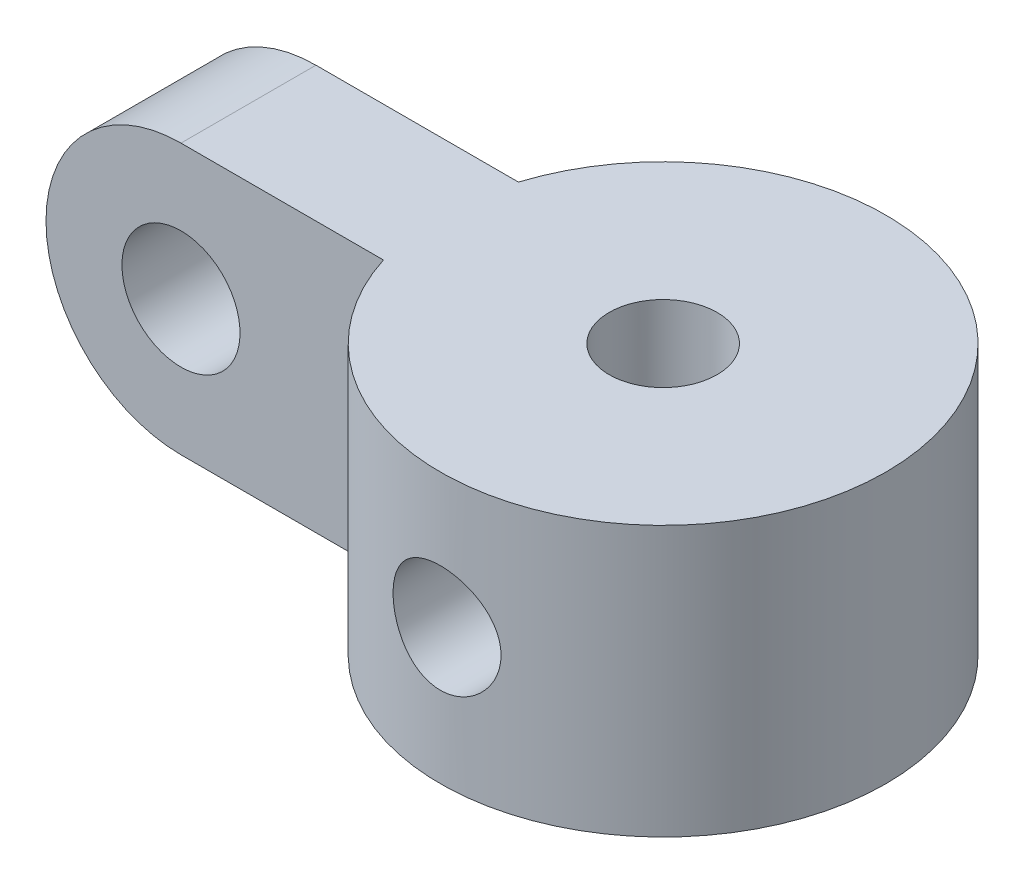
ISO-10303-21;
HEADER;
FILE_DESCRIPTION(('STEP AP214'),'2;1');
FILE_NAME('part.step','',(''),(''),'','','');
FILE_SCHEMA(('AUTOMOTIVE_DESIGN { 1 0 10303 214 1 1 1 1 }'));
ENDSEC;
DATA;
#1=APPLICATION_CONTEXT('core data for automotive mechanical design processes');
#2=APPLICATION_PROTOCOL_DEFINITION('international standard','automotive_design',2000,#1);
#3=PRODUCT_CONTEXT('',#1,'mechanical');
#4=PRODUCT('Part','Part','',(#3));
#5=PRODUCT_RELATED_PRODUCT_CATEGORY('part','',(#4));
#6=PRODUCT_DEFINITION_FORMATION('','',#4);
#7=PRODUCT_DEFINITION_CONTEXT('part definition',#1,'design');
#8=PRODUCT_DEFINITION('design','',#6,#7);
#9=PRODUCT_DEFINITION_SHAPE('','',#8);
#10=(LENGTH_UNIT() NAMED_UNIT(*) SI_UNIT(.MILLI.,.METRE.));
#11=(NAMED_UNIT(*) PLANE_ANGLE_UNIT() SI_UNIT($,.RADIAN.));
#12=(NAMED_UNIT(*) SI_UNIT($,.STERADIAN.) SOLID_ANGLE_UNIT());
#13=UNCERTAINTY_MEASURE_WITH_UNIT(LENGTH_MEASURE(1.E-05),#10,'distance_accuracy_value','');
#14=(GEOMETRIC_REPRESENTATION_CONTEXT(3) GLOBAL_UNCERTAINTY_ASSIGNED_CONTEXT((#13)) GLOBAL_UNIT_ASSIGNED_CONTEXT((#10,
#11,#12)) REPRESENTATION_CONTEXT('',''));
#15=CARTESIAN_POINT('',(0.,0.,0.));
#16=DIRECTION('',(0.,0.,1.));
#17=DIRECTION('',(1.,0.,0.));
#18=AXIS2_PLACEMENT_3D('',#15,#16,#17);
#19=CARTESIAN_POINT('',(0.,8.,2.));
#20=DIRECTION('',(0.,0.,1.));
#21=DIRECTION('',(-1.,0.,0.));
#22=AXIS2_PLACEMENT_3D('',#19,#20,#21);
#23=PLANE('',#22);
#24=CARTESIAN_POINT('',(-12.2896740774066,4.,2.));
#25=DIRECTION('',(0.,0.,-1.));
#26=DIRECTION('',(-1.,0.,0.));
#27=AXIS2_PLACEMENT_3D('',#24,#25,#26);
#28=CIRCLE('',#27,1.75);
#29=CARTESIAN_POINT('',(-14.0396740774066,4.,2.));
#30=VERTEX_POINT('',#29);
#31=EDGE_CURVE('E288',#30,#30,#28,.T.);
#32=ORIENTED_EDGE('',*,*,#31,.T.);
#33=EDGE_LOOP('',(#32));
#34=FACE_BOUND('',#33,.T.);
#35=DIRECTION('',(1.,0.,0.));
#36=VECTOR('',#35,1.);
#37=CARTESIAN_POINT('',(0.,0.,2.));
#38=LINE('',#37,#36);
#39=CARTESIAN_POINT('',(-12.2896740774066,0.,2.));
#40=VERTEX_POINT('',#39);
#41=CARTESIAN_POINT('',(-6.28967407740656,0.,2.));
#42=VERTEX_POINT('',#41);
#43=EDGE_CURVE('E105',#40,#42,#38,.T.);
#44=ORIENTED_EDGE('',*,*,#43,.T.);
#45=DIRECTION('',(0.,-1.,0.));
#46=VECTOR('',#45,1.);
#47=CARTESIAN_POINT('',(-6.28967407740656,8.,2.));
#48=LINE('',#47,#46);
#49=CARTESIAN_POINT('',(-6.28967407740656,8.,2.));
#50=VERTEX_POINT('',#49);
#51=EDGE_CURVE('E123',#50,#42,#48,.T.);
#52=ORIENTED_EDGE('',*,*,#51,.F.);
#53=DIRECTION('',(1.,0.,0.));
#54=VECTOR('',#53,1.);
#55=CARTESIAN_POINT('',(0.,8.,2.));
#56=LINE('',#55,#54);
#57=CARTESIAN_POINT('',(-12.2896740774066,8.,2.));
#58=VERTEX_POINT('',#57);
#59=EDGE_CURVE('E107',#58,#50,#56,.T.);
#60=ORIENTED_EDGE('',*,*,#59,.F.);
#61=CARTESIAN_POINT('',(-12.2896740774066,4.,2.));
#62=DIRECTION('',(0.,0.,-1.));
#63=DIRECTION('',(-1.,0.,0.));
#64=AXIS2_PLACEMENT_3D('',#61,#62,#63);
#65=CIRCLE('',#64,4.);
#66=EDGE_CURVE('E92',#40,#58,#65,.T.);
#67=ORIENTED_EDGE('',*,*,#66,.F.);
#68=EDGE_LOOP('',(#44,#52,#60,#67));
#69=FACE_BOUND('',#68,.T.);
#70=ADVANCED_FACE('F43',(#34,#69),#23,.T.);
#71=CARTESIAN_POINT('',(0.,8.,-2.));
#72=DIRECTION('',(0.,0.,1.));
#73=DIRECTION('',(-1.,0.,0.));
#74=AXIS2_PLACEMENT_3D('',#71,#72,#73);
#75=PLANE('',#74);
#76=CARTESIAN_POINT('',(-12.2896740774066,4.,-2.));
#77=DIRECTION('',(0.,0.,-1.));
#78=DIRECTION('',(-1.,0.,0.));
#79=AXIS2_PLACEMENT_3D('',#76,#77,#78);
#80=CIRCLE('',#79,1.75);
#81=CARTESIAN_POINT('',(-14.0396740774066,4.,-2.));
#82=VERTEX_POINT('',#81);
#83=EDGE_CURVE('E47',#82,#82,#80,.T.);
#84=ORIENTED_EDGE('',*,*,#83,.F.);
#85=EDGE_LOOP('',(#84));
#86=FACE_BOUND('',#85,.T.);
#87=CARTESIAN_POINT('',(-12.2896740774066,4.,-2.));
#88=DIRECTION('',(0.,0.,-1.));
#89=DIRECTION('',(-1.,0.,0.));
#90=AXIS2_PLACEMENT_3D('',#87,#88,#89);
#91=CIRCLE('',#90,4.);
#92=CARTESIAN_POINT('',(-12.2896740774066,0.,-2.));
#93=VERTEX_POINT('',#92);
#94=CARTESIAN_POINT('',(-12.2896740774066,8.,-2.));
#95=VERTEX_POINT('',#94);
#96=EDGE_CURVE('E95',#93,#95,#91,.T.);
#97=ORIENTED_EDGE('',*,*,#96,.T.);
#98=DIRECTION('',(1.,0.,0.));
#99=VECTOR('',#98,1.);
#100=CARTESIAN_POINT('',(0.,8.,-2.));
#101=LINE('',#100,#99);
#102=CARTESIAN_POINT('',(-6.28967407740656,8.,-2.));
#103=VERTEX_POINT('',#102);
#104=EDGE_CURVE('E124',#95,#103,#101,.T.);
#105=ORIENTED_EDGE('',*,*,#104,.T.);
#106=DIRECTION('',(0.,-1.,0.));
#107=VECTOR('',#106,1.);
#108=CARTESIAN_POINT('',(-6.28967407740656,8.,-2.));
#109=LINE('',#108,#107);
#110=CARTESIAN_POINT('',(-6.28967407740656,0.,-2.));
#111=VERTEX_POINT('',#110);
#112=EDGE_CURVE('E120',#103,#111,#109,.T.);
#113=ORIENTED_EDGE('',*,*,#112,.T.);
#114=DIRECTION('',(1.,0.,0.));
#115=VECTOR('',#114,1.);
#116=CARTESIAN_POINT('',(0.,0.,-2.));
#117=LINE('',#116,#115);
#118=EDGE_CURVE('E113',#93,#111,#117,.T.);
#119=ORIENTED_EDGE('',*,*,#118,.F.);
#120=EDGE_LOOP('',(#97,#105,#113,#119));
#121=FACE_BOUND('',#120,.T.);
#122=ADVANCED_FACE('F172',(#86,#121),#75,.F.);
#123=CARTESIAN_POINT('',(0.,8.,0.));
#124=DIRECTION('',(0.,-1.,0.));
#125=DIRECTION('',(0.,0.,1.));
#126=AXIS2_PLACEMENT_3D('',#123,#124,#125);
#127=CYLINDRICAL_SURFACE('',#126,1.6);
#128=CARTESIAN_POINT('',(0.,4.,0.));
#129=DIRECTION('',(0.,0.707106781186547,0.707106781186547));
#130=DIRECTION('',(0.,-0.707106781186547,0.707106781186547));
#131=AXIS2_PLACEMENT_3D('',#128,#129,#130);
#132=ELLIPSE('',#131,2.26274169979695,1.6);
#133=CARTESIAN_POINT('',(-1.6,4.,0.));
#134=VERTEX_POINT('',#133);
#135=CARTESIAN_POINT('',(1.6,4.,0.));
#136=VERTEX_POINT('',#135);
#137=EDGE_CURVE('E11',#134,#136,#132,.F.);
#138=ORIENTED_EDGE('',*,*,#137,.T.);
#139=CARTESIAN_POINT('',(0.,4.,0.));
#140=DIRECTION('',(0.,0.707106781186547,-0.707106781186547));
#141=DIRECTION('',(0.,-0.707106781186547,-0.707106781186547));
#142=AXIS2_PLACEMENT_3D('',#139,#140,#141);
#143=ELLIPSE('',#142,2.26274169979695,1.6);
#144=EDGE_CURVE('E100',#136,#134,#143,.F.);
#145=ORIENTED_EDGE('',*,*,#144,.T.);
#146=EDGE_LOOP('',(#138,#145));
#147=FACE_BOUND('',#146,.T.);
#148=CARTESIAN_POINT('',(0.,8.,0.));
#149=DIRECTION('',(0.,-1.,0.));
#150=DIRECTION('',(0.,0.,-1.));
#151=AXIS2_PLACEMENT_3D('',#148,#149,#150);
#152=CIRCLE('',#151,1.6);
#153=CARTESIAN_POINT('',(0.,8.,-1.6));
#154=VERTEX_POINT('',#153);
#155=EDGE_CURVE('E115',#154,#154,#152,.T.);
#156=ORIENTED_EDGE('',*,*,#155,.F.);
#157=EDGE_LOOP('',(#156));
#158=FACE_BOUND('',#157,.T.);
#159=ADVANCED_FACE('F138',(#147,#158),#127,.F.);
#160=CARTESIAN_POINT('',(0.,0.,0.));
#161=DIRECTION('',(0.,1.,0.));
#162=DIRECTION('',(0.,0.,-1.));
#163=AXIS2_PLACEMENT_3D('',#160,#161,#162);
#164=PLANE('',#163);
#165=CARTESIAN_POINT('',(0.,0.,0.));
#166=DIRECTION('',(0.,-1.,0.));
#167=DIRECTION('',(0.,0.,-1.));
#168=AXIS2_PLACEMENT_3D('',#165,#166,#167);
#169=CIRCLE('',#168,1.6);
#170=CARTESIAN_POINT('',(0.,0.,-1.6));
#171=VERTEX_POINT('',#170);
#172=EDGE_CURVE('E108',#171,#171,#169,.T.);
#173=ORIENTED_EDGE('',*,*,#172,.F.);
#174=EDGE_LOOP('',(#173));
#175=FACE_BOUND('',#174,.T.);
#176=DIRECTION('',(0.,0.,-1.));
#177=VECTOR('',#176,1.);
#178=CARTESIAN_POINT('',(-12.2896740774066,0.,6.6));
#179=LINE('',#178,#177);
#180=EDGE_CURVE('E89',#40,#93,#179,.T.);
#181=ORIENTED_EDGE('',*,*,#180,.T.);
#182=ORIENTED_EDGE('',*,*,#118,.T.);
#183=CARTESIAN_POINT('',(0.,0.,0.));
#184=DIRECTION('',(0.,-1.,0.));
#185=DIRECTION('',(0.,0.,-1.));
#186=AXIS2_PLACEMENT_3D('',#183,#184,#185);
#187=CIRCLE('',#186,6.6);
#188=EDGE_CURVE('E111',#111,#42,#187,.T.);
#189=ORIENTED_EDGE('',*,*,#188,.T.);
#190=ORIENTED_EDGE('',*,*,#43,.F.);
#191=EDGE_LOOP('',(#181,#182,#189,#190));
#192=FACE_BOUND('',#191,.T.);
#193=ADVANCED_FACE('F110',(#175,#192),#164,.F.);
#194=CARTESIAN_POINT('',(0.,8.,0.));
#195=DIRECTION('',(0.,1.,0.));
#196=DIRECTION('',(0.,0.,-1.));
#197=AXIS2_PLACEMENT_3D('',#194,#195,#196);
#198=PLANE('',#197);
#199=ORIENTED_EDGE('',*,*,#155,.T.);
#200=EDGE_LOOP('',(#199));
#201=FACE_BOUND('',#200,.T.);
#202=ORIENTED_EDGE('',*,*,#59,.T.);
#203=CARTESIAN_POINT('',(0.,8.,0.));
#204=DIRECTION('',(0.,-1.,0.));
#205=DIRECTION('',(0.,0.,-1.));
#206=AXIS2_PLACEMENT_3D('',#203,#204,#205);
#207=CIRCLE('',#206,6.6);
#208=EDGE_CURVE('E295',#103,#50,#207,.T.);
#209=ORIENTED_EDGE('',*,*,#208,.F.);
#210=ORIENTED_EDGE('',*,*,#104,.F.);
#211=DIRECTION('',(0.,0.,-1.));
#212=VECTOR('',#211,1.);
#213=CARTESIAN_POINT('',(-12.2896740774066,8.,6.6));
#214=LINE('',#213,#212);
#215=EDGE_CURVE('E66',#58,#95,#214,.T.);
#216=ORIENTED_EDGE('',*,*,#215,.F.);
#217=EDGE_LOOP('',(#202,#209,#210,#216));
#218=FACE_BOUND('',#217,.T.);
#219=ADVANCED_FACE('F167',(#201,#218),#198,.T.);
#220=CARTESIAN_POINT('',(0.,8.,0.));
#221=DIRECTION('',(0.,-1.,0.));
#222=DIRECTION('',(0.,0.,1.));
#223=AXIS2_PLACEMENT_3D('',#220,#221,#222);
#224=CYLINDRICAL_SURFACE('',#223,6.6);
#225=CARTESIAN_POINT('',(1.6,4.,6.40312423743285));
#226=CARTESIAN_POINT('',(1.59999733947836,4.08844402406098,6.40312597037609));
#227=CARTESIAN_POINT('',(1.59264157848281,4.17691809600071,6.40497670400888));
#228=CARTESIAN_POINT('',(1.56345601743318,4.35133182154082,6.4121621325328));
#229=CARTESIAN_POINT('',(1.54161728105349,4.43726987614424,6.41749897840401));
#230=CARTESIAN_POINT('',(1.48420900234039,4.60406355514517,6.43101748536075));
#231=CARTESIAN_POINT('',(1.44865650524925,4.68492534448298,6.43919561368331));
#232=CARTESIAN_POINT('',(1.3648810998873,4.83954379086885,6.45747086045777));
#233=CARTESIAN_POINT('',(1.31665785249965,4.91330025767959,6.46756803026843));
#234=CARTESIAN_POINT('',(1.20784389900135,5.05314159602282,6.48877758318028));
#235=CARTESIAN_POINT('',(1.14703929913897,5.11905772455782,6.49990538881894));
#236=CARTESIAN_POINT('',(1.01524965153105,5.23986289597431,6.5217882988137));
#237=CARTESIAN_POINT('',(0.944263695721746,5.29475095422509,6.53254336981968));
#238=CARTESIAN_POINT('',(0.792976530006599,5.39262652396975,6.55263898037571));
#239=CARTESIAN_POINT('',(0.71256570600993,5.43544913714583,6.56195919706409));
#240=CARTESIAN_POINT('',(0.545423893058168,5.50690743021361,6.57795945463852));
#241=CARTESIAN_POINT('',(0.458693781262912,5.53554507478769,6.58463986112431));
#242=CARTESIAN_POINT('',(0.28313343703087,5.57728248350463,6.59449878121048));
#243=CARTESIAN_POINT('',(0.194374956348101,5.59066857236418,6.59774174354862));
#244=CARTESIAN_POINT('',(0.0158168750524344,5.60242074593819,6.60058464260182));
#245=CARTESIAN_POINT('',(-0.0739825787233714,5.60078892390197,6.60018508702391));
#246=CARTESIAN_POINT('',(-0.25009076322241,5.5827593886002,6.59583627033507));
#247=CARTESIAN_POINT('',(-0.336433231377963,5.56667061845232,6.59196128200833));
#248=CARTESIAN_POINT('',(-0.505154519829912,5.52067938716169,6.58118299179282));
#249=CARTESIAN_POINT('',(-0.587533136198652,5.49077621614884,6.57427953428333));
#250=CARTESIAN_POINT('',(-0.74681326529544,5.41774922909505,6.55810487467464));
#251=CARTESIAN_POINT('',(-0.823661440791099,5.37451366657421,6.54881377443151));
#252=CARTESIAN_POINT('',(-0.969121094903154,5.27613357148008,6.52887450690487));
#253=CARTESIAN_POINT('',(-1.03773121476807,5.22098707855287,6.51822611635086));
#254=CARTESIAN_POINT('',(-1.16660863727456,5.09868762962085,6.49641521034034));
#255=CARTESIAN_POINT('',(-1.22661882104947,5.03126455163238,6.48524650824044));
#256=CARTESIAN_POINT('',(-1.33453585965573,4.88719490884861,6.46390352969242));
#257=CARTESIAN_POINT('',(-1.38244221584308,4.81054796424765,6.45372929422414));
#258=CARTESIAN_POINT('',(-1.46494322915083,4.64972470273884,6.43550637883586));
#259=CARTESIAN_POINT('',(-1.4994794029305,4.56551724795948,6.42746708453676));
#260=CARTESIAN_POINT('',(-1.55382718977604,4.39225039215391,6.41454673226991));
#261=CARTESIAN_POINT('',(-1.57364174189015,4.30319196339657,6.40966504393782));
#262=CARTESIAN_POINT('',(-1.59756435294379,4.12512682937485,6.40374402358904));
#263=CARTESIAN_POINT('',(-1.60205110778769,4.03617402039503,6.40261207062851));
#264=CARTESIAN_POINT('',(-1.59622462099622,3.85879092404816,6.40406713975094));
#265=CARTESIAN_POINT('',(-1.58591265192973,3.77036059240892,6.4066538420601));
#266=CARTESIAN_POINT('',(-1.55111264233716,3.59791634012609,6.41516633208495));
#267=CARTESIAN_POINT('',(-1.52684202876438,3.51385577255964,6.42104086992378));
#268=CARTESIAN_POINT('',(-1.46505330245464,3.35099563472862,6.43541907577093));
#269=CARTESIAN_POINT('',(-1.427533693674,3.27219665978537,6.44392304067414));
#270=CARTESIAN_POINT('',(-1.33950890361332,3.12048324751841,6.46279907110407));
#271=CARTESIAN_POINT('',(-1.28877556385843,3.04770522515797,6.47320288866304));
#272=CARTESIAN_POINT('',(-1.176054449739,2.91155642689974,6.49462703788132));
#273=CARTESIAN_POINT('',(-1.11406494115952,2.84818710331931,6.50564746435902));
#274=CARTESIAN_POINT('',(-0.978859243852804,2.73113684816081,6.52737484171816));
#275=CARTESIAN_POINT('',(-0.905414542587484,2.67771694544761,6.5380684476914));
#276=CARTESIAN_POINT('',(-0.750376177663217,2.58397023624514,6.55766967940658));
#277=CARTESIAN_POINT('',(-0.668782931491631,2.54364275942034,6.56657739657757));
#278=CARTESIAN_POINT('',(-0.500317828978865,2.47756489223356,6.58154809251216));
#279=CARTESIAN_POINT('',(-0.413487967421985,2.45171216041208,6.58763099011155));
#280=CARTESIAN_POINT('',(-0.236550277056997,2.41500676666825,6.59635362322054));
#281=CARTESIAN_POINT('',(-0.146443043735652,2.40415139361489,6.5989939810466));
#282=CARTESIAN_POINT('',(0.0320330834287471,2.39789370197624,6.60051038370048));
#283=CARTESIAN_POINT('',(0.120387845166776,2.4021050810357,6.59948053308083));
#284=CARTESIAN_POINT('',(0.295090603727327,2.42498180031035,6.59397912156365));
#285=CARTESIAN_POINT('',(0.381438653778092,2.44364675669111,6.58950765206303));
#286=CARTESIAN_POINT('',(0.549299070646439,2.49469887896567,6.57763810488231));
#287=CARTESIAN_POINT('',(0.630832598167391,2.52701996018495,6.57025413266408));
#288=CARTESIAN_POINT('',(0.787364816025318,2.60440616156891,6.55333973860274));
#289=CARTESIAN_POINT('',(0.862362725594601,2.64947280163974,6.54380906079289));
#290=CARTESIAN_POINT('',(1.00554031833552,2.75226967813651,6.52336129617945));
#291=CARTESIAN_POINT('',(1.07352623332947,2.81026451788978,6.51241761643753));
#292=CARTESIAN_POINT('',(1.19893242972994,2.93675265363601,6.49050250288316));
#293=CARTESIAN_POINT('',(1.25635006733463,3.00524856878544,6.47953106282008));
#294=CARTESIAN_POINT('',(1.35995880768537,3.15221778456658,6.45858815699281));
#295=CARTESIAN_POINT('',(1.40593901379458,3.23084290180638,6.448637221504));
#296=CARTESIAN_POINT('',(1.48395977964431,3.39493550764195,6.43113315660768));
#297=CARTESIAN_POINT('',(1.51601091235572,3.48039774791219,6.42357820968792));
#298=CARTESIAN_POINT('',(1.56024691692113,3.63814570603387,6.41295817096726));
#299=CARTESIAN_POINT('',(1.57512286070378,3.70964864102359,6.40929733413103));
#300=CARTESIAN_POINT('',(1.59500013121856,3.85409430607224,6.40437974225737));
#301=CARTESIAN_POINT('',(1.60000219483265,3.92703692827776,6.40312280781832));
#302=CARTESIAN_POINT('',(1.6,4.,6.40312423743285));
#303=B_SPLINE_CURVE_WITH_KNOTS('',3,(#225,#226,#227,#228,#229,#230,#231,#232,#233,#234,#235,
#236,#237,#238,#239,#240,#241,#242,#243,#244,#245,#246,#247,#248,#249,#250,#251,#252,#253,#254,
#255,#256,#257,#258,#259,#260,#261,#262,#263,#264,#265,#266,#267,#268,#269,#270,#271,#272,#273,
#274,#275,#276,#277,#278,#279,#280,#281,#282,#283,#284,#285,#286,#287,#288,#289,#290,#291,#292,
#293,#294,#295,#296,#297,#298,#299,#300,#301,#302),.UNSPECIFIED.,.T.,.F.,(4,2,2,2,2,2,2,2,2,2,2,
2,2,2,2,2,2,2,2,2,2,2,2,2,2,2,2,2,2,2,2,2,2,2,2,2,2,2,4),(0.,0.265064273258436,
0.530292249566571,0.795191622869191,1.0600980865956,1.32994540119492,1.59981679815771,
1.87321504847942,2.14657542130955,2.41471463941518,2.68281648389817,2.94532180998148,
3.20784062672676,3.47262248908861,3.73744796368044,4.00902119378664,4.28060561013037,
4.55336490852977,4.82606973818098,5.09198626575298,5.35787992805489,5.619739930883,
5.88162951175322,6.1483813618781,6.41517434484027,6.68820231251325,6.96121629887957,
7.23227478485269,7.50328426411234,7.76739558504667,8.03149989238554,8.29434052625653,
8.55721251706291,8.82606066778539,9.09497598347789,9.36853321512672,9.64188243681685,
9.86056704862862,10.0792353395176),.UNSPECIFIED.);
#304=CARTESIAN_POINT('',(1.6,4.,6.40312423743285));
#305=VERTEX_POINT('',#304);
#306=EDGE_CURVE('E149',#305,#305,#303,.T.);
#307=ORIENTED_EDGE('',*,*,#306,.F.);
#308=EDGE_LOOP('',(#307));
#309=FACE_BOUND('',#308,.T.);
#310=CARTESIAN_POINT('',(1.6,4.,-6.40312423743285));
#311=CARTESIAN_POINT('',(1.59999733947836,3.91155597593902,-6.40312597037609));
#312=CARTESIAN_POINT('',(1.59264157848281,3.82308190399929,-6.40497670400888));
#313=CARTESIAN_POINT('',(1.56345601743318,3.64866817845918,-6.4121621325328));
#314=CARTESIAN_POINT('',(1.54161728105349,3.56273012385576,-6.41749897840401));
#315=CARTESIAN_POINT('',(1.48420900234039,3.39593644485483,-6.43101748536075));
#316=CARTESIAN_POINT('',(1.44865650524925,3.31507465551702,-6.43919561368331));
#317=CARTESIAN_POINT('',(1.3648810998873,3.16045620913115,-6.45747086045777));
#318=CARTESIAN_POINT('',(1.31665785249964,3.08669974232041,-6.46756803026843));
#319=CARTESIAN_POINT('',(1.20784389900135,2.94685840397718,-6.48877758318028));
#320=CARTESIAN_POINT('',(1.14703929913897,2.88094227544218,-6.49990538881894));
#321=CARTESIAN_POINT('',(1.01524965153105,2.76013710402569,-6.5217882988137));
#322=CARTESIAN_POINT('',(0.944263695721746,2.70524904577491,-6.53254336981968));
#323=CARTESIAN_POINT('',(0.792976530006598,2.60737347603025,-6.55263898037571));
#324=CARTESIAN_POINT('',(0.712565706009929,2.56455086285417,-6.56195919706409));
#325=CARTESIAN_POINT('',(0.545423893058167,2.49309256978639,-6.57795945463852));
#326=CARTESIAN_POINT('',(0.458693781262911,2.46445492521231,-6.58463986112431));
#327=CARTESIAN_POINT('',(0.283133437030869,2.42271751649537,-6.59449878121048));
#328=CARTESIAN_POINT('',(0.1943749563481,2.40933142763582,-6.59774174354862));
#329=CARTESIAN_POINT('',(0.015816875052433,2.39757925406181,-6.60058464260182));
#330=CARTESIAN_POINT('',(-0.0739825787233729,2.39921107609803,-6.60018508702391));
#331=CARTESIAN_POINT('',(-0.250090763222411,2.4172406113998,-6.59583627033507));
#332=CARTESIAN_POINT('',(-0.336433231377964,2.43332938154768,-6.59196128200833));
#333=CARTESIAN_POINT('',(-0.505154519829913,2.47932061283831,-6.58118299179282));
#334=CARTESIAN_POINT('',(-0.587533136198653,2.50922378385116,-6.57427953428333));
#335=CARTESIAN_POINT('',(-0.746813265295442,2.58225077090495,-6.55810487467464));
#336=CARTESIAN_POINT('',(-0.823661440791101,2.62548633342579,-6.54881377443151));
#337=CARTESIAN_POINT('',(-0.969121094903155,2.72386642851992,-6.52887450690487));
#338=CARTESIAN_POINT('',(-1.03773121476807,2.77901292144713,-6.51822611635086));
#339=CARTESIAN_POINT('',(-1.16660863727457,2.90131237037916,-6.49641521034034));
#340=CARTESIAN_POINT('',(-1.22661882104947,2.96873544836762,-6.48524650824044));
#341=CARTESIAN_POINT('',(-1.33453585965573,3.11280509115139,-6.46390352969242));
#342=CARTESIAN_POINT('',(-1.38244221584308,3.18945203575236,-6.45372929422414));
#343=CARTESIAN_POINT('',(-1.46494322915083,3.35027529726117,-6.43550637883586));
#344=CARTESIAN_POINT('',(-1.4994794029305,3.43448275204052,-6.42746708453676));
#345=CARTESIAN_POINT('',(-1.55382718977604,3.60774960784609,-6.41454673226991));
#346=CARTESIAN_POINT('',(-1.57364174189015,3.69680803660343,-6.40966504393782));
#347=CARTESIAN_POINT('',(-1.59756435294379,3.87487317062515,-6.40374402358904));
#348=CARTESIAN_POINT('',(-1.60205110778769,3.96382597960497,-6.40261207062851));
#349=CARTESIAN_POINT('',(-1.59622462099622,4.14120907595185,-6.40406713975094));
#350=CARTESIAN_POINT('',(-1.58591265192973,4.22963940759109,-6.4066538420601));
#351=CARTESIAN_POINT('',(-1.55111264233716,4.40208365987391,-6.41516633208495));
#352=CARTESIAN_POINT('',(-1.52684202876438,4.48614422744036,-6.42104086992378));
#353=CARTESIAN_POINT('',(-1.46505330245464,4.64900436527138,-6.43541907577093));
#354=CARTESIAN_POINT('',(-1.427533693674,4.72780334021463,-6.44392304067414));
#355=CARTESIAN_POINT('',(-1.33950890361332,4.87951675248159,-6.46279907110407));
#356=CARTESIAN_POINT('',(-1.28877556385843,4.95229477484203,-6.47320288866304));
#357=CARTESIAN_POINT('',(-1.176054449739,5.08844357310027,-6.49462703788132));
#358=CARTESIAN_POINT('',(-1.11406494115952,5.15181289668069,-6.50564746435903));
#359=CARTESIAN_POINT('',(-0.978859243852802,5.2688631518392,-6.52737484171817));
#360=CARTESIAN_POINT('',(-0.905414542587482,5.3222830545524,-6.5380684476914));
#361=CARTESIAN_POINT('',(-0.750376177663215,5.41602976375486,-6.55766967940658));
#362=CARTESIAN_POINT('',(-0.668782931491629,5.45635724057966,-6.56657739657757));
#363=CARTESIAN_POINT('',(-0.500317828978863,5.52243510776645,-6.58154809251216));
#364=CARTESIAN_POINT('',(-0.413487967421983,5.54828783958792,-6.58763099011155));
#365=CARTESIAN_POINT('',(-0.236550277056996,5.58499323333175,-6.59635362322054));
#366=CARTESIAN_POINT('',(-0.14644304373565,5.59584860638511,-6.5989939810466));
#367=CARTESIAN_POINT('',(0.0320330834287485,5.60210629802376,-6.60051038370048));
#368=CARTESIAN_POINT('',(0.120387845166777,5.5978949189643,-6.59948053308083));
#369=CARTESIAN_POINT('',(0.295090603727328,5.57501819968965,-6.59397912156365));
#370=CARTESIAN_POINT('',(0.381438653778093,5.55635324330889,-6.58950765206303));
#371=CARTESIAN_POINT('',(0.549299070646441,5.50530112103433,-6.57763810488231));
#372=CARTESIAN_POINT('',(0.630832598167394,5.47298003981505,-6.57025413266408));
#373=CARTESIAN_POINT('',(0.787364816025321,5.39559383843109,-6.55333973860274));
#374=CARTESIAN_POINT('',(0.862362725594603,5.35052719836026,-6.54380906079289));
#375=CARTESIAN_POINT('',(1.00554031833552,5.24773032186349,-6.52336129617945));
#376=CARTESIAN_POINT('',(1.07352623332948,5.18973548211022,-6.51241761643753));
#377=CARTESIAN_POINT('',(1.19893242972994,5.06324734636399,-6.49050250288316));
#378=CARTESIAN_POINT('',(1.25635006733463,4.99475143121456,-6.47953106282008));
#379=CARTESIAN_POINT('',(1.35995880768537,4.84778221543341,-6.45858815699281));
#380=CARTESIAN_POINT('',(1.40593901379458,4.76915709819362,-6.448637221504));
#381=CARTESIAN_POINT('',(1.48395977964431,4.60506449235805,-6.43113315660768));
#382=CARTESIAN_POINT('',(1.51601091235572,4.51960225208781,-6.42357820968792));
#383=CARTESIAN_POINT('',(1.56024691692113,4.36185429396613,-6.41295817096726));
#384=CARTESIAN_POINT('',(1.57512286070378,4.29035135897641,-6.40929733413103));
#385=CARTESIAN_POINT('',(1.59500013121856,4.14590569392776,-6.40437974225737));
#386=CARTESIAN_POINT('',(1.60000219483265,4.07296307172224,-6.40312280781832));
#387=CARTESIAN_POINT('',(1.6,4.,-6.40312423743285));
#388=B_SPLINE_CURVE_WITH_KNOTS('',3,(#310,#311,#312,#313,#314,#315,#316,#317,#318,#319,#320,
#321,#322,#323,#324,#325,#326,#327,#328,#329,#330,#331,#332,#333,#334,#335,#336,#337,#338,#339,
#340,#341,#342,#343,#344,#345,#346,#347,#348,#349,#350,#351,#352,#353,#354,#355,#356,#357,#358,
#359,#360,#361,#362,#363,#364,#365,#366,#367,#368,#369,#370,#371,#372,#373,#374,#375,#376,#377,
#378,#379,#380,#381,#382,#383,#384,#385,#386,#387),.UNSPECIFIED.,.T.,.F.,(4,2,2,2,2,2,2,2,2,2,2,
2,2,2,2,2,2,2,2,2,2,2,2,2,2,2,2,2,2,2,2,2,2,2,2,2,2,2,4),(0.,0.265064273258436,
0.530292249566571,0.795191622869193,1.0600980865956,1.32994540119492,1.59981679815771,
1.87321504847942,2.14657542130956,2.41471463941518,2.68281648389817,2.94532180998148,
3.20784062672676,3.47262248908861,3.73744796368044,4.00902119378665,4.28060561013037,
4.55336490852977,4.82606973818099,5.09198626575298,5.3578799280549,5.619739930883,
5.88162951175322,6.1483813618781,6.41517434484028,6.68820231251325,6.96121629887958,
7.23227478485269,7.50328426411234,7.76739558504667,8.03149989238554,8.29434052625654,
8.55721251706292,8.82606066778539,9.09497598347789,9.36853321512673,9.64188243681686,
9.86056704862863,10.0792353395176),.UNSPECIFIED.);
#389=CARTESIAN_POINT('',(1.6,4.,-6.40312423743285));
#390=VERTEX_POINT('',#389);
#391=EDGE_CURVE('E147',#390,#390,#388,.T.);
#392=ORIENTED_EDGE('',*,*,#391,.F.);
#393=EDGE_LOOP('',(#392));
#394=FACE_BOUND('',#393,.T.);
#395=ORIENTED_EDGE('',*,*,#188,.F.);
#396=ORIENTED_EDGE('',*,*,#112,.F.);
#397=ORIENTED_EDGE('',*,*,#208,.T.);
#398=ORIENTED_EDGE('',*,*,#51,.T.);
#399=EDGE_LOOP('',(#395,#396,#397,#398));
#400=FACE_BOUND('',#399,.T.);
#401=ADVANCED_FACE('F163',(#309,#394,#400),#224,.T.);
#402=CARTESIAN_POINT('',(0.,4.,0.));
#403=DIRECTION('',(0.,0.707106781186547,0.707106781186547));
#404=DIRECTION('',(0.,-0.707106781186547,0.707106781186547));
#405=AXIS2_PLACEMENT_3D('',#402,#403,#404);
#406=ELLIPSE('',#405,2.26274169979695,1.6);
#407=EDGE_CURVE('E52',#134,#136,#406,.T.);
#408=ORIENTED_EDGE('',*,*,#407,.T.);
#409=CARTESIAN_POINT('',(0.,4.,0.));
#410=DIRECTION('',(0.,0.707106781186547,-0.707106781186547));
#411=DIRECTION('',(0.,-0.707106781186547,-0.707106781186547));
#412=AXIS2_PLACEMENT_3D('',#409,#410,#411);
#413=ELLIPSE('',#412,2.26274169979695,1.6);
#414=EDGE_CURVE('E58',#136,#134,#413,.T.);
#415=ORIENTED_EDGE('',*,*,#414,.T.);
#416=EDGE_LOOP('',(#408,#415));
#417=FACE_BOUND('',#416,.T.);
#418=ORIENTED_EDGE('',*,*,#172,.T.);
#419=EDGE_LOOP('',(#418));
#420=FACE_BOUND('',#419,.T.);
#421=ADVANCED_FACE('F45',(#417,#420),#127,.F.);
#422=CARTESIAN_POINT('',(-12.2896740774066,4.,6.6));
#423=DIRECTION('',(0.,0.,-1.));
#424=DIRECTION('',(1.,0.,0.));
#425=AXIS2_PLACEMENT_3D('',#422,#423,#424);
#426=CYLINDRICAL_SURFACE('',#425,4.);
#427=ORIENTED_EDGE('',*,*,#66,.T.);
#428=ORIENTED_EDGE('',*,*,#215,.T.);
#429=ORIENTED_EDGE('',*,*,#96,.F.);
#430=ORIENTED_EDGE('',*,*,#180,.F.);
#431=EDGE_LOOP('',(#427,#428,#429,#430));
#432=FACE_BOUND('',#431,.T.);
#433=ADVANCED_FACE('F91',(#432),#426,.T.);
#434=CARTESIAN_POINT('',(0.,4.,6.6));
#435=DIRECTION('',(0.,0.,-1.));
#436=DIRECTION('',(1.,0.,0.));
#437=AXIS2_PLACEMENT_3D('',#434,#435,#436);
#438=CYLINDRICAL_SURFACE('',#437,1.6);
#439=ORIENTED_EDGE('',*,*,#407,.F.);
#440=ORIENTED_EDGE('',*,*,#144,.F.);
#441=EDGE_LOOP('',(#439,#440));
#442=FACE_BOUND('',#441,.T.);
#443=ORIENTED_EDGE('',*,*,#306,.T.);
#444=EDGE_LOOP('',(#443));
#445=FACE_BOUND('',#444,.T.);
#446=ADVANCED_FACE('F135',(#442,#445),#438,.F.);
#447=ORIENTED_EDGE('',*,*,#137,.F.);
#448=ORIENTED_EDGE('',*,*,#414,.F.);
#449=EDGE_LOOP('',(#447,#448));
#450=FACE_BOUND('',#449,.T.);
#451=ORIENTED_EDGE('',*,*,#391,.T.);
#452=EDGE_LOOP('',(#451));
#453=FACE_BOUND('',#452,.T.);
#454=ADVANCED_FACE('F140',(#450,#453),#438,.F.);
#455=CARTESIAN_POINT('',(-12.2896740774066,4.,6.6));
#456=DIRECTION('',(0.,0.,-1.));
#457=DIRECTION('',(1.,0.,0.));
#458=AXIS2_PLACEMENT_3D('',#455,#456,#457);
#459=CYLINDRICAL_SURFACE('',#458,1.75);
#460=ORIENTED_EDGE('',*,*,#31,.F.);
#461=EDGE_LOOP('',(#460));
#462=FACE_BOUND('',#461,.T.);
#463=ORIENTED_EDGE('',*,*,#83,.T.);
#464=EDGE_LOOP('',(#463));
#465=FACE_BOUND('',#464,.T.);
#466=ADVANCED_FACE('F143',(#462,#465),#459,.F.);
#467=CLOSED_SHELL('',(#70,#122,#159,#193,#219,#401,#421,#433,#446,#454,#466));
#468=MANIFOLD_SOLID_BREP('B2',#467);
#469=ADVANCED_BREP_SHAPE_REPRESENTATION('',(#18,#468),#14);
#470=SHAPE_DEFINITION_REPRESENTATION(#9,#469);
ENDSEC;
END-ISO-10303-21;
